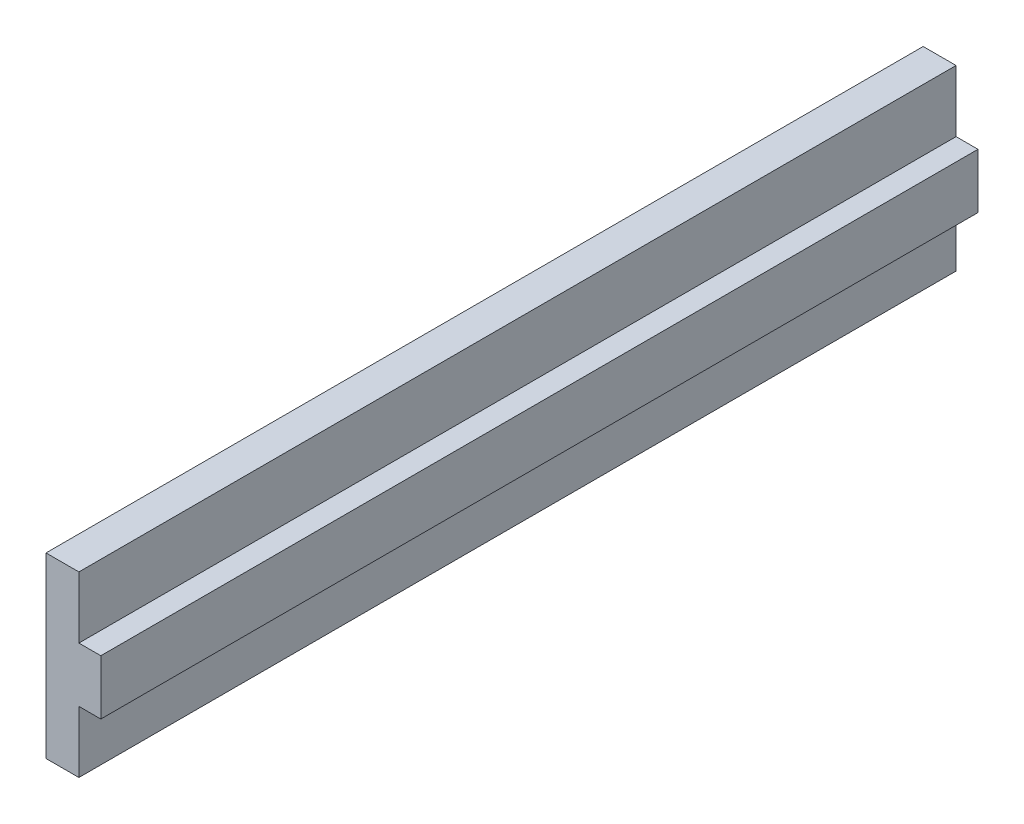
ISO-10303-21;
HEADER;
FILE_DESCRIPTION(('STEP AP214'),'2;1');
FILE_NAME('part.step','',(''),(''),'','','');
FILE_SCHEMA(('AUTOMOTIVE_DESIGN { 1 0 10303 214 1 1 1 1 }'));
ENDSEC;
DATA;
#1=APPLICATION_CONTEXT('core data for automotive mechanical design processes');
#2=APPLICATION_PROTOCOL_DEFINITION('international standard','automotive_design',2000,#1);
#3=PRODUCT_CONTEXT('',#1,'mechanical');
#4=PRODUCT('Part','Part','',(#3));
#5=PRODUCT_RELATED_PRODUCT_CATEGORY('part','',(#4));
#6=PRODUCT_DEFINITION_FORMATION('','',#4);
#7=PRODUCT_DEFINITION_CONTEXT('part definition',#1,'design');
#8=PRODUCT_DEFINITION('design','',#6,#7);
#9=PRODUCT_DEFINITION_SHAPE('','',#8);
#10=(LENGTH_UNIT() NAMED_UNIT(*) SI_UNIT(.MILLI.,.METRE.));
#11=(NAMED_UNIT(*) PLANE_ANGLE_UNIT() SI_UNIT($,.RADIAN.));
#12=(NAMED_UNIT(*) SI_UNIT($,.STERADIAN.) SOLID_ANGLE_UNIT());
#13=UNCERTAINTY_MEASURE_WITH_UNIT(LENGTH_MEASURE(1.E-05),#10,'distance_accuracy_value','');
#14=(GEOMETRIC_REPRESENTATION_CONTEXT(3) GLOBAL_UNCERTAINTY_ASSIGNED_CONTEXT((#13)) GLOBAL_UNIT_ASSIGNED_CONTEXT((#10,
#11,#12)) REPRESENTATION_CONTEXT('',''));
#15=CARTESIAN_POINT('',(0.,0.,0.));
#16=DIRECTION('',(0.,0.,1.));
#17=DIRECTION('',(1.,0.,0.));
#18=AXIS2_PLACEMENT_3D('',#15,#16,#17);
#19=CARTESIAN_POINT('',(3.81,0.,101.6));
#20=DIRECTION('',(0.,1.,0.));
#21=DIRECTION('',(-1.,0.,0.));
#22=AXIS2_PLACEMENT_3D('',#19,#20,#21);
#23=PLANE('',#22);
#24=DIRECTION('',(1.,0.,0.));
#25=VECTOR('',#24,1.);
#26=CARTESIAN_POINT('',(3.81,0.,0.));
#27=LINE('',#26,#25);
#28=CARTESIAN_POINT('',(0.,0.,0.));
#29=VERTEX_POINT('',#28);
#30=CARTESIAN_POINT('',(3.81,0.,0.));
#31=VERTEX_POINT('',#30);
#32=EDGE_CURVE('E131',#29,#31,#27,.T.);
#33=ORIENTED_EDGE('',*,*,#32,.T.);
#34=DIRECTION('',(0.,0.,-1.));
#35=VECTOR('',#34,1.);
#36=CARTESIAN_POINT('',(3.81,0.,101.6));
#37=LINE('',#36,#35);
#38=CARTESIAN_POINT('',(3.81,0.,101.6));
#39=VERTEX_POINT('',#38);
#40=EDGE_CURVE('E11',#39,#31,#37,.T.);
#41=ORIENTED_EDGE('',*,*,#40,.F.);
#42=DIRECTION('',(1.,0.,0.));
#43=VECTOR('',#42,1.);
#44=CARTESIAN_POINT('',(3.81,0.,101.6));
#45=LINE('',#44,#43);
#46=CARTESIAN_POINT('',(0.,0.,101.6));
#47=VERTEX_POINT('',#46);
#48=EDGE_CURVE('E145',#47,#39,#45,.T.);
#49=ORIENTED_EDGE('',*,*,#48,.F.);
#50=DIRECTION('',(0.,0.,-1.));
#51=VECTOR('',#50,1.);
#52=CARTESIAN_POINT('',(0.,0.,101.6));
#53=LINE('',#52,#51);
#54=EDGE_CURVE('E127',#47,#29,#53,.T.);
#55=ORIENTED_EDGE('',*,*,#54,.T.);
#56=EDGE_LOOP('',(#33,#41,#49,#55));
#57=FACE_BOUND('',#56,.T.);
#58=ADVANCED_FACE('F35',(#57),#23,.F.);
#59=CARTESIAN_POINT('',(3.81,7.1374,101.6));
#60=DIRECTION('',(-1.,0.,0.));
#61=DIRECTION('',(0.,0.,1.));
#62=AXIS2_PLACEMENT_3D('',#59,#60,#61);
#63=PLANE('',#62);
#64=DIRECTION('',(0.,1.,0.));
#65=VECTOR('',#64,1.);
#66=CARTESIAN_POINT('',(3.81,7.1374,0.));
#67=LINE('',#66,#65);
#68=CARTESIAN_POINT('',(3.81,7.1374,0.));
#69=VERTEX_POINT('',#68);
#70=EDGE_CURVE('E134',#31,#69,#67,.T.);
#71=ORIENTED_EDGE('',*,*,#70,.T.);
#72=DIRECTION('',(0.,0.,-1.));
#73=VECTOR('',#72,1.);
#74=CARTESIAN_POINT('',(3.81,7.1374,101.6));
#75=LINE('',#74,#73);
#76=CARTESIAN_POINT('',(3.81,7.1374,101.6));
#77=VERTEX_POINT('',#76);
#78=EDGE_CURVE('E43',#77,#69,#75,.T.);
#79=ORIENTED_EDGE('',*,*,#78,.F.);
#80=DIRECTION('',(0.,1.,0.));
#81=VECTOR('',#80,1.);
#82=CARTESIAN_POINT('',(3.81,7.1374,101.6));
#83=LINE('',#82,#81);
#84=EDGE_CURVE('E94',#39,#77,#83,.T.);
#85=ORIENTED_EDGE('',*,*,#84,.F.);
#86=ORIENTED_EDGE('',*,*,#40,.T.);
#87=EDGE_LOOP('',(#71,#79,#85,#86));
#88=FACE_BOUND('',#87,.T.);
#89=ADVANCED_FACE('F180',(#88),#63,.F.);
#90=CARTESIAN_POINT('',(6.35,7.1374,101.6));
#91=DIRECTION('',(0.,1.,0.));
#92=DIRECTION('',(-1.,0.,0.));
#93=AXIS2_PLACEMENT_3D('',#90,#91,#92);
#94=PLANE('',#93);
#95=DIRECTION('',(1.,0.,0.));
#96=VECTOR('',#95,1.);
#97=CARTESIAN_POINT('',(6.35,7.1374,0.));
#98=LINE('',#97,#96);
#99=CARTESIAN_POINT('',(6.35,7.1374,0.));
#100=VERTEX_POINT('',#99);
#101=EDGE_CURVE('E136',#69,#100,#98,.T.);
#102=ORIENTED_EDGE('',*,*,#101,.T.);
#103=DIRECTION('',(0.,0.,-1.));
#104=VECTOR('',#103,1.);
#105=CARTESIAN_POINT('',(6.35,7.1374,101.6));
#106=LINE('',#105,#104);
#107=CARTESIAN_POINT('',(6.35,7.1374,101.6));
#108=VERTEX_POINT('',#107);
#109=EDGE_CURVE('E152',#108,#100,#106,.T.);
#110=ORIENTED_EDGE('',*,*,#109,.F.);
#111=DIRECTION('',(1.,0.,0.));
#112=VECTOR('',#111,1.);
#113=CARTESIAN_POINT('',(6.35,7.1374,101.6));
#114=LINE('',#113,#112);
#115=EDGE_CURVE('E160',#77,#108,#114,.T.);
#116=ORIENTED_EDGE('',*,*,#115,.F.);
#117=ORIENTED_EDGE('',*,*,#78,.T.);
#118=EDGE_LOOP('',(#102,#110,#116,#117));
#119=FACE_BOUND('',#118,.T.);
#120=ADVANCED_FACE('F158',(#119),#94,.F.);
#121=CARTESIAN_POINT('',(6.35,13.4874,101.6));
#122=DIRECTION('',(-1.,0.,0.));
#123=DIRECTION('',(0.,0.,1.));
#124=AXIS2_PLACEMENT_3D('',#121,#122,#123);
#125=PLANE('',#124);
#126=DIRECTION('',(0.,1.,0.));
#127=VECTOR('',#126,1.);
#128=CARTESIAN_POINT('',(6.35,13.4874,0.));
#129=LINE('',#128,#127);
#130=CARTESIAN_POINT('',(6.35,13.4874,0.));
#131=VERTEX_POINT('',#130);
#132=EDGE_CURVE('E138',#100,#131,#129,.T.);
#133=ORIENTED_EDGE('',*,*,#132,.T.);
#134=DIRECTION('',(0.,0.,-1.));
#135=VECTOR('',#134,1.);
#136=CARTESIAN_POINT('',(6.35,13.4874,101.6));
#137=LINE('',#136,#135);
#138=CARTESIAN_POINT('',(6.35,13.4874,101.6));
#139=VERTEX_POINT('',#138);
#140=EDGE_CURVE('E149',#139,#131,#137,.T.);
#141=ORIENTED_EDGE('',*,*,#140,.F.);
#142=DIRECTION('',(0.,1.,0.));
#143=VECTOR('',#142,1.);
#144=CARTESIAN_POINT('',(6.35,13.4874,101.6));
#145=LINE('',#144,#143);
#146=EDGE_CURVE('E172',#108,#139,#145,.T.);
#147=ORIENTED_EDGE('',*,*,#146,.F.);
#148=ORIENTED_EDGE('',*,*,#109,.T.);
#149=EDGE_LOOP('',(#133,#141,#147,#148));
#150=FACE_BOUND('',#149,.T.);
#151=ADVANCED_FACE('F168',(#150),#125,.F.);
#152=CARTESIAN_POINT('',(3.81,13.4874,101.6));
#153=DIRECTION('',(0.,-1.,0.));
#154=DIRECTION('',(1.,0.,0.));
#155=AXIS2_PLACEMENT_3D('',#152,#153,#154);
#156=PLANE('',#155);
#157=DIRECTION('',(-1.,0.,0.));
#158=VECTOR('',#157,1.);
#159=CARTESIAN_POINT('',(3.81,13.4874,0.));
#160=LINE('',#159,#158);
#161=CARTESIAN_POINT('',(3.81,13.4874,0.));
#162=VERTEX_POINT('',#161);
#163=EDGE_CURVE('E140',#131,#162,#160,.T.);
#164=ORIENTED_EDGE('',*,*,#163,.T.);
#165=DIRECTION('',(0.,0.,-1.));
#166=VECTOR('',#165,1.);
#167=CARTESIAN_POINT('',(3.81,13.4874,101.6));
#168=LINE('',#167,#166);
#169=CARTESIAN_POINT('',(3.81,13.4874,101.6));
#170=VERTEX_POINT('',#169);
#171=EDGE_CURVE('E122',#170,#162,#168,.T.);
#172=ORIENTED_EDGE('',*,*,#171,.F.);
#173=DIRECTION('',(-1.,0.,0.));
#174=VECTOR('',#173,1.);
#175=CARTESIAN_POINT('',(3.81,13.4874,101.6));
#176=LINE('',#175,#174);
#177=EDGE_CURVE('E113',#139,#170,#176,.T.);
#178=ORIENTED_EDGE('',*,*,#177,.F.);
#179=ORIENTED_EDGE('',*,*,#140,.T.);
#180=EDGE_LOOP('',(#164,#172,#178,#179));
#181=FACE_BOUND('',#180,.T.);
#182=ADVANCED_FACE('F171',(#181),#156,.F.);
#183=CARTESIAN_POINT('',(3.81,20.6248,101.6));
#184=DIRECTION('',(-1.,0.,0.));
#185=DIRECTION('',(0.,-1.,0.));
#186=AXIS2_PLACEMENT_3D('',#183,#184,#185);
#187=PLANE('',#186);
#188=DIRECTION('',(0.,1.,0.));
#189=VECTOR('',#188,1.);
#190=CARTESIAN_POINT('',(3.81,20.6248,0.));
#191=LINE('',#190,#189);
#192=CARTESIAN_POINT('',(3.81,20.6248,0.));
#193=VERTEX_POINT('',#192);
#194=EDGE_CURVE('E121',#162,#193,#191,.T.);
#195=ORIENTED_EDGE('',*,*,#194,.T.);
#196=DIRECTION('',(0.,0.,-1.));
#197=VECTOR('',#196,1.);
#198=CARTESIAN_POINT('',(3.81,20.6248,101.6));
#199=LINE('',#198,#197);
#200=CARTESIAN_POINT('',(3.81,20.6248,101.6));
#201=VERTEX_POINT('',#200);
#202=EDGE_CURVE('E118',#201,#193,#199,.T.);
#203=ORIENTED_EDGE('',*,*,#202,.F.);
#204=DIRECTION('',(0.,1.,0.));
#205=VECTOR('',#204,1.);
#206=CARTESIAN_POINT('',(3.81,20.6248,101.6));
#207=LINE('',#206,#205);
#208=EDGE_CURVE('E107',#170,#201,#207,.T.);
#209=ORIENTED_EDGE('',*,*,#208,.F.);
#210=ORIENTED_EDGE('',*,*,#171,.T.);
#211=EDGE_LOOP('',(#195,#203,#209,#210));
#212=FACE_BOUND('',#211,.T.);
#213=ADVANCED_FACE('F119',(#212),#187,.F.);
#214=CARTESIAN_POINT('',(0.,20.6248,101.6));
#215=DIRECTION('',(0.,-1.,0.));
#216=DIRECTION('',(0.,0.,-1.));
#217=AXIS2_PLACEMENT_3D('',#214,#215,#216);
#218=PLANE('',#217);
#219=DIRECTION('',(-1.,0.,0.));
#220=VECTOR('',#219,1.);
#221=CARTESIAN_POINT('',(0.,20.6248,0.));
#222=LINE('',#221,#220);
#223=CARTESIAN_POINT('',(0.,20.6248,0.));
#224=VERTEX_POINT('',#223);
#225=EDGE_CURVE('E80',#193,#224,#222,.T.);
#226=ORIENTED_EDGE('',*,*,#225,.T.);
#227=DIRECTION('',(0.,0.,-1.));
#228=VECTOR('',#227,1.);
#229=CARTESIAN_POINT('',(0.,20.6248,101.6));
#230=LINE('',#229,#228);
#231=CARTESIAN_POINT('',(0.,20.6248,101.6));
#232=VERTEX_POINT('',#231);
#233=EDGE_CURVE('E123',#232,#224,#230,.T.);
#234=ORIENTED_EDGE('',*,*,#233,.F.);
#235=DIRECTION('',(-1.,0.,0.));
#236=VECTOR('',#235,1.);
#237=CARTESIAN_POINT('',(0.,20.6248,101.6));
#238=LINE('',#237,#236);
#239=EDGE_CURVE('E111',#201,#232,#238,.T.);
#240=ORIENTED_EDGE('',*,*,#239,.F.);
#241=ORIENTED_EDGE('',*,*,#202,.T.);
#242=EDGE_LOOP('',(#226,#234,#240,#241));
#243=FACE_BOUND('',#242,.T.);
#244=ADVANCED_FACE('F125',(#243),#218,.F.);
#245=CARTESIAN_POINT('',(0.,0.,101.6));
#246=DIRECTION('',(1.,0.,0.));
#247=DIRECTION('',(0.,0.,-1.));
#248=AXIS2_PLACEMENT_3D('',#245,#246,#247);
#249=PLANE('',#248);
#250=DIRECTION('',(0.,-1.,0.));
#251=VECTOR('',#250,1.);
#252=CARTESIAN_POINT('',(0.,0.,0.));
#253=LINE('',#252,#251);
#254=EDGE_CURVE('E86',#224,#29,#253,.T.);
#255=ORIENTED_EDGE('',*,*,#254,.T.);
#256=ORIENTED_EDGE('',*,*,#54,.F.);
#257=DIRECTION('',(0.,-1.,0.));
#258=VECTOR('',#257,1.);
#259=CARTESIAN_POINT('',(0.,0.,101.6));
#260=LINE('',#259,#258);
#261=EDGE_CURVE('E51',#232,#47,#260,.T.);
#262=ORIENTED_EDGE('',*,*,#261,.F.);
#263=ORIENTED_EDGE('',*,*,#233,.T.);
#264=EDGE_LOOP('',(#255,#256,#262,#263));
#265=FACE_BOUND('',#264,.T.);
#266=ADVANCED_FACE('F196',(#265),#249,.F.);
#267=CARTESIAN_POINT('',(0.,0.,101.6));
#268=DIRECTION('',(0.,0.,-1.));
#269=DIRECTION('',(-1.,0.,0.));
#270=AXIS2_PLACEMENT_3D('',#267,#268,#269);
#271=PLANE('',#270);
#272=ORIENTED_EDGE('',*,*,#48,.T.);
#273=ORIENTED_EDGE('',*,*,#84,.T.);
#274=ORIENTED_EDGE('',*,*,#115,.T.);
#275=ORIENTED_EDGE('',*,*,#146,.T.);
#276=ORIENTED_EDGE('',*,*,#177,.T.);
#277=ORIENTED_EDGE('',*,*,#208,.T.);
#278=ORIENTED_EDGE('',*,*,#239,.T.);
#279=ORIENTED_EDGE('',*,*,#261,.T.);
#280=EDGE_LOOP('',(#272,#273,#274,#275,#276,#277,#278,#279));
#281=FACE_BOUND('',#280,.T.);
#282=ADVANCED_FACE('F109',(#281),#271,.F.);
#283=CARTESIAN_POINT('',(0.,0.,0.));
#284=DIRECTION('',(0.,0.,-1.));
#285=DIRECTION('',(-1.,0.,0.));
#286=AXIS2_PLACEMENT_3D('',#283,#284,#285);
#287=PLANE('',#286);
#288=ORIENTED_EDGE('',*,*,#32,.F.);
#289=ORIENTED_EDGE('',*,*,#254,.F.);
#290=ORIENTED_EDGE('',*,*,#225,.F.);
#291=ORIENTED_EDGE('',*,*,#194,.F.);
#292=ORIENTED_EDGE('',*,*,#163,.F.);
#293=ORIENTED_EDGE('',*,*,#132,.F.);
#294=ORIENTED_EDGE('',*,*,#101,.F.);
#295=ORIENTED_EDGE('',*,*,#70,.F.);
#296=EDGE_LOOP('',(#288,#289,#290,#291,#292,#293,#294,#295));
#297=FACE_BOUND('',#296,.T.);
#298=ADVANCED_FACE('F164',(#297),#287,.T.);
#299=CLOSED_SHELL('',(#58,#89,#120,#151,#182,#213,#244,#266,#282,#298));
#300=MANIFOLD_SOLID_BREP('B2',#299);
#301=ADVANCED_BREP_SHAPE_REPRESENTATION('',(#18,#300),#14);
#302=SHAPE_DEFINITION_REPRESENTATION(#9,#301);
ENDSEC;
END-ISO-10303-21;
